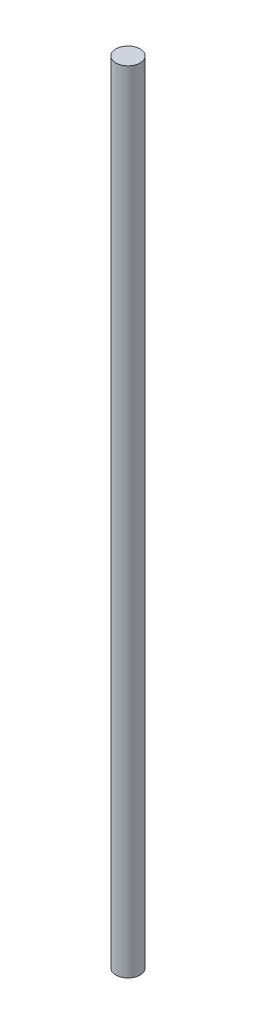
ISO-10303-21;
HEADER;
FILE_DESCRIPTION(('STEP AP214'),'2;1');
FILE_NAME('part.step','',(''),(''),'','','');
FILE_SCHEMA(('AUTOMOTIVE_DESIGN { 1 0 10303 214 1 1 1 1 }'));
ENDSEC;
DATA;
#1=APPLICATION_CONTEXT('core data for automotive mechanical design processes');
#2=APPLICATION_PROTOCOL_DEFINITION('international standard','automotive_design',2000,#1);
#3=PRODUCT_CONTEXT('',#1,'mechanical');
#4=PRODUCT('Part','Part','',(#3));
#5=PRODUCT_RELATED_PRODUCT_CATEGORY('part','',(#4));
#6=PRODUCT_DEFINITION_FORMATION('','',#4);
#7=PRODUCT_DEFINITION_CONTEXT('part definition',#1,'design');
#8=PRODUCT_DEFINITION('design','',#6,#7);
#9=PRODUCT_DEFINITION_SHAPE('','',#8);
#10=(LENGTH_UNIT() NAMED_UNIT(*) SI_UNIT(.MILLI.,.METRE.));
#11=(NAMED_UNIT(*) PLANE_ANGLE_UNIT() SI_UNIT($,.RADIAN.));
#12=(NAMED_UNIT(*) SI_UNIT($,.STERADIAN.) SOLID_ANGLE_UNIT());
#13=UNCERTAINTY_MEASURE_WITH_UNIT(LENGTH_MEASURE(1.E-05),#10,'distance_accuracy_value','');
#14=(GEOMETRIC_REPRESENTATION_CONTEXT(3) GLOBAL_UNCERTAINTY_ASSIGNED_CONTEXT((#13)) GLOBAL_UNIT_ASSIGNED_CONTEXT((#10,
#11,#12)) REPRESENTATION_CONTEXT('',''));
#15=CARTESIAN_POINT('',(0.,0.,0.));
#16=DIRECTION('',(0.,0.,1.));
#17=DIRECTION('',(1.,0.,0.));
#18=AXIS2_PLACEMENT_3D('',#15,#16,#17);
#19=CARTESIAN_POINT('',(0.,260.,0.));
#20=DIRECTION('',(0.,-1.,0.));
#21=DIRECTION('',(0.,0.,-1.));
#22=AXIS2_PLACEMENT_3D('',#19,#20,#21);
#23=CYLINDRICAL_SURFACE('',#22,4.);
#24=CARTESIAN_POINT('',(0.,260.,0.));
#25=DIRECTION('',(0.,1.,0.));
#26=DIRECTION('',(0.,0.,1.));
#27=AXIS2_PLACEMENT_3D('',#24,#25,#26);
#28=CIRCLE('',#27,4.);
#29=CARTESIAN_POINT('',(0.,260.,4.));
#30=VERTEX_POINT('',#29);
#31=EDGE_CURVE('E10',#30,#30,#28,.T.);
#32=ORIENTED_EDGE('',*,*,#31,.F.);
#33=EDGE_LOOP('',(#32));
#34=FACE_BOUND('',#33,.T.);
#35=CARTESIAN_POINT('',(0.,0.,0.));
#36=DIRECTION('',(0.,1.,0.));
#37=DIRECTION('',(0.,0.,1.));
#38=AXIS2_PLACEMENT_3D('',#35,#36,#37);
#39=CIRCLE('',#38,4.);
#40=CARTESIAN_POINT('',(0.,0.,4.));
#41=VERTEX_POINT('',#40);
#42=EDGE_CURVE('E36',#41,#41,#39,.T.);
#43=ORIENTED_EDGE('',*,*,#42,.T.);
#44=EDGE_LOOP('',(#43));
#45=FACE_BOUND('',#44,.T.);
#46=ADVANCED_FACE('F33',(#34,#45),#23,.T.);
#47=CARTESIAN_POINT('',(0.,260.,0.));
#48=DIRECTION('',(0.,1.,0.));
#49=DIRECTION('',(0.,0.,1.));
#50=AXIS2_PLACEMENT_3D('',#47,#48,#49);
#51=PLANE('',#50);
#52=ORIENTED_EDGE('',*,*,#31,.T.);
#53=EDGE_LOOP('',(#52));
#54=FACE_BOUND('',#53,.T.);
#55=ADVANCED_FACE('F48',(#54),#51,.T.);
#56=CARTESIAN_POINT('',(0.,0.,0.));
#57=DIRECTION('',(0.,1.,0.));
#58=DIRECTION('',(0.,0.,1.));
#59=AXIS2_PLACEMENT_3D('',#56,#57,#58);
#60=PLANE('',#59);
#61=ORIENTED_EDGE('',*,*,#42,.F.);
#62=EDGE_LOOP('',(#61));
#63=FACE_BOUND('',#62,.T.);
#64=ADVANCED_FACE('F46',(#63),#60,.F.);
#65=CLOSED_SHELL('',(#46,#55,#64));
#66=MANIFOLD_SOLID_BREP('B2',#65);
#67=ADVANCED_BREP_SHAPE_REPRESENTATION('',(#18,#66),#14);
#68=SHAPE_DEFINITION_REPRESENTATION(#9,#67);
ENDSEC;
END-ISO-10303-21;
